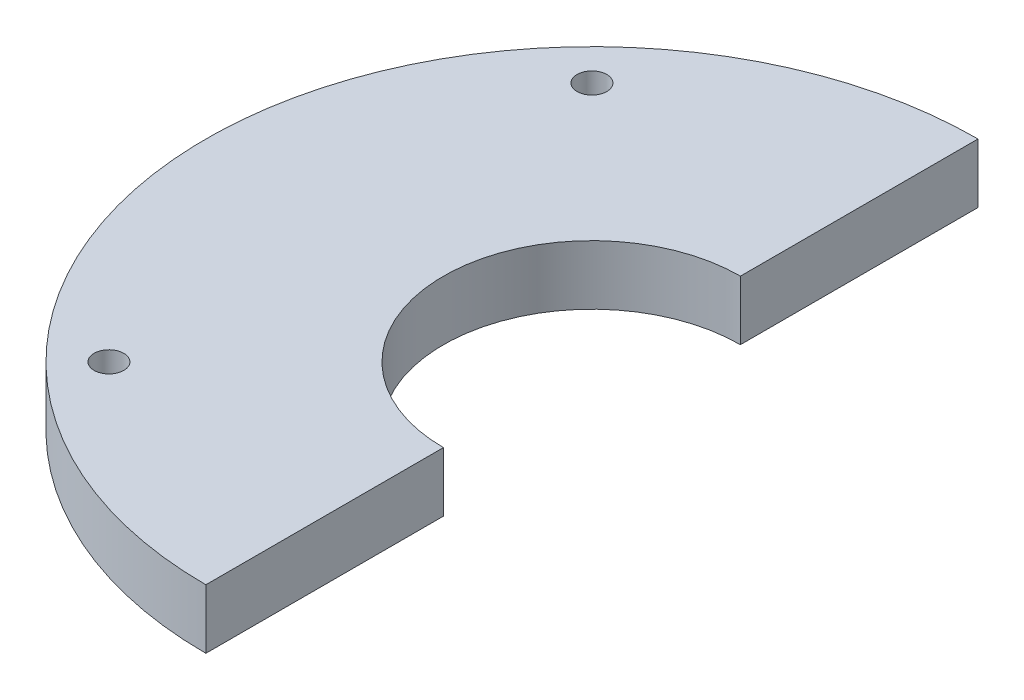
ISO-10303-21;
HEADER;
FILE_DESCRIPTION(('STEP AP214'),'2;1');
FILE_NAME('part.step','',(''),(''),'','','');
FILE_SCHEMA(('AUTOMOTIVE_DESIGN { 1 0 10303 214 1 1 1 1 }'));
ENDSEC;
DATA;
#1=APPLICATION_CONTEXT('core data for automotive mechanical design processes');
#2=APPLICATION_PROTOCOL_DEFINITION('international standard','automotive_design',2000,#1);
#3=PRODUCT_CONTEXT('',#1,'mechanical');
#4=PRODUCT('Part','Part','',(#3));
#5=PRODUCT_RELATED_PRODUCT_CATEGORY('part','',(#4));
#6=PRODUCT_DEFINITION_FORMATION('','',#4);
#7=PRODUCT_DEFINITION_CONTEXT('part definition',#1,'design');
#8=PRODUCT_DEFINITION('design','',#6,#7);
#9=PRODUCT_DEFINITION_SHAPE('','',#8);
#10=(LENGTH_UNIT() NAMED_UNIT(*) SI_UNIT(.MILLI.,.METRE.));
#11=(NAMED_UNIT(*) PLANE_ANGLE_UNIT() SI_UNIT($,.RADIAN.));
#12=(NAMED_UNIT(*) SI_UNIT($,.STERADIAN.) SOLID_ANGLE_UNIT());
#13=UNCERTAINTY_MEASURE_WITH_UNIT(LENGTH_MEASURE(1.E-05),#10,'distance_accuracy_value','');
#14=(GEOMETRIC_REPRESENTATION_CONTEXT(3) GLOBAL_UNCERTAINTY_ASSIGNED_CONTEXT((#13)) GLOBAL_UNIT_ASSIGNED_CONTEXT((#10,
#11,#12)) REPRESENTATION_CONTEXT('',''));
#15=CARTESIAN_POINT('',(0.,0.,0.));
#16=DIRECTION('',(0.,0.,1.));
#17=DIRECTION('',(1.,0.,0.));
#18=AXIS2_PLACEMENT_3D('',#15,#16,#17);
#19=CARTESIAN_POINT('',(0.,10.,0.));
#20=DIRECTION('',(0.,-1.,0.));
#21=DIRECTION('',(0.,0.,-1.));
#22=AXIS2_PLACEMENT_3D('',#19,#20,#21);
#23=CYLINDRICAL_SURFACE('',#22,25.);
#24=CARTESIAN_POINT('',(0.,0.,0.));
#25=DIRECTION('',(0.,-1.,0.));
#26=DIRECTION('',(0.,0.,1.));
#27=AXIS2_PLACEMENT_3D('',#24,#25,#26);
#28=CIRCLE('',#27,25.);
#29=CARTESIAN_POINT('',(0.,0.,25.));
#30=VERTEX_POINT('',#29);
#31=CARTESIAN_POINT('',(0.,0.,-25.));
#32=VERTEX_POINT('',#31);
#33=EDGE_CURVE('E110',#30,#32,#28,.T.);
#34=ORIENTED_EDGE('',*,*,#33,.T.);
#35=DIRECTION('',(0.,-1.,0.));
#36=VECTOR('',#35,1.);
#37=CARTESIAN_POINT('',(0.,10.,-25.));
#38=LINE('',#37,#36);
#39=CARTESIAN_POINT('',(0.,10.,-25.));
#40=VERTEX_POINT('',#39);
#41=EDGE_CURVE('E11',#40,#32,#38,.T.);
#42=ORIENTED_EDGE('',*,*,#41,.F.);
#43=CARTESIAN_POINT('',(0.,10.,0.));
#44=DIRECTION('',(0.,-1.,0.));
#45=DIRECTION('',(0.,0.,1.));
#46=AXIS2_PLACEMENT_3D('',#43,#44,#45);
#47=CIRCLE('',#46,25.);
#48=CARTESIAN_POINT('',(0.,10.,25.));
#49=VERTEX_POINT('',#48);
#50=EDGE_CURVE('E94',#49,#40,#47,.T.);
#51=ORIENTED_EDGE('',*,*,#50,.F.);
#52=DIRECTION('',(0.,-1.,0.));
#53=VECTOR('',#52,1.);
#54=CARTESIAN_POINT('',(0.,10.,25.));
#55=LINE('',#54,#53);
#56=EDGE_CURVE('E106',#49,#30,#55,.T.);
#57=ORIENTED_EDGE('',*,*,#56,.T.);
#58=EDGE_LOOP('',(#34,#42,#51,#57));
#59=FACE_BOUND('',#58,.T.);
#60=ADVANCED_FACE('F42',(#59),#23,.F.);
#61=CARTESIAN_POINT('',(0.,10.,-64.9999999999999));
#62=DIRECTION('',(-1.,0.,0.));
#63=DIRECTION('',(0.,0.,1.));
#64=AXIS2_PLACEMENT_3D('',#61,#62,#63);
#65=PLANE('',#64);
#66=DIRECTION('',(0.,0.,-1.));
#67=VECTOR('',#66,1.);
#68=CARTESIAN_POINT('',(0.,0.,-64.9999999999999));
#69=LINE('',#68,#67);
#70=CARTESIAN_POINT('',(0.,0.,-64.9999999999999));
#71=VERTEX_POINT('',#70);
#72=EDGE_CURVE('E99',#32,#71,#69,.T.);
#73=ORIENTED_EDGE('',*,*,#72,.T.);
#74=DIRECTION('',(0.,-1.,0.));
#75=VECTOR('',#74,1.);
#76=CARTESIAN_POINT('',(0.,10.,-64.9999999999999));
#77=LINE('',#76,#75);
#78=CARTESIAN_POINT('',(0.,10.,-64.9999999999999));
#79=VERTEX_POINT('',#78);
#80=EDGE_CURVE('E51',#79,#71,#77,.T.);
#81=ORIENTED_EDGE('',*,*,#80,.F.);
#82=DIRECTION('',(0.,0.,-1.));
#83=VECTOR('',#82,1.);
#84=CARTESIAN_POINT('',(0.,10.,-64.9999999999999));
#85=LINE('',#84,#83);
#86=EDGE_CURVE('E89',#40,#79,#85,.T.);
#87=ORIENTED_EDGE('',*,*,#86,.F.);
#88=ORIENTED_EDGE('',*,*,#41,.T.);
#89=EDGE_LOOP('',(#73,#81,#87,#88));
#90=FACE_BOUND('',#89,.T.);
#91=ADVANCED_FACE('F98',(#90),#65,.F.);
#92=CARTESIAN_POINT('',(0.,10.,0.));
#93=DIRECTION('',(0.,-1.,0.));
#94=DIRECTION('',(0.,0.,-1.));
#95=AXIS2_PLACEMENT_3D('',#92,#93,#94);
#96=CYLINDRICAL_SURFACE('',#95,64.9999999999999);
#97=CARTESIAN_POINT('',(0.,0.,0.));
#98=DIRECTION('',(0.,1.,0.));
#99=DIRECTION('',(0.,0.,1.));
#100=AXIS2_PLACEMENT_3D('',#97,#98,#99);
#101=CIRCLE('',#100,64.9999999999999);
#102=CARTESIAN_POINT('',(0.,0.,64.9999999999999));
#103=VERTEX_POINT('',#102);
#104=EDGE_CURVE('E76',#71,#103,#101,.T.);
#105=ORIENTED_EDGE('',*,*,#104,.T.);
#106=DIRECTION('',(0.,-1.,0.));
#107=VECTOR('',#106,1.);
#108=CARTESIAN_POINT('',(0.,10.,64.9999999999999));
#109=LINE('',#108,#107);
#110=CARTESIAN_POINT('',(0.,10.,64.9999999999999));
#111=VERTEX_POINT('',#110);
#112=EDGE_CURVE('E101',#111,#103,#109,.T.);
#113=ORIENTED_EDGE('',*,*,#112,.F.);
#114=CARTESIAN_POINT('',(0.,10.,0.));
#115=DIRECTION('',(0.,1.,0.));
#116=DIRECTION('',(0.,0.,1.));
#117=AXIS2_PLACEMENT_3D('',#114,#115,#116);
#118=CIRCLE('',#117,64.9999999999999);
#119=EDGE_CURVE('E92',#79,#111,#118,.T.);
#120=ORIENTED_EDGE('',*,*,#119,.F.);
#121=ORIENTED_EDGE('',*,*,#80,.T.);
#122=EDGE_LOOP('',(#105,#113,#120,#121));
#123=FACE_BOUND('',#122,.T.);
#124=ADVANCED_FACE('F102',(#123),#96,.T.);
#125=CARTESIAN_POINT('',(0.,10.,25.));
#126=DIRECTION('',(-1.,0.,0.));
#127=DIRECTION('',(0.,0.,1.));
#128=AXIS2_PLACEMENT_3D('',#125,#126,#127);
#129=PLANE('',#128);
#130=DIRECTION('',(0.,0.,-1.));
#131=VECTOR('',#130,1.);
#132=CARTESIAN_POINT('',(0.,0.,25.));
#133=LINE('',#132,#131);
#134=EDGE_CURVE('E82',#103,#30,#133,.T.);
#135=ORIENTED_EDGE('',*,*,#134,.T.);
#136=ORIENTED_EDGE('',*,*,#56,.F.);
#137=DIRECTION('',(0.,0.,-1.));
#138=VECTOR('',#137,1.);
#139=CARTESIAN_POINT('',(0.,10.,25.));
#140=LINE('',#139,#138);
#141=EDGE_CURVE('E59',#111,#49,#140,.T.);
#142=ORIENTED_EDGE('',*,*,#141,.F.);
#143=ORIENTED_EDGE('',*,*,#112,.T.);
#144=EDGE_LOOP('',(#135,#136,#142,#143));
#145=FACE_BOUND('',#144,.T.);
#146=ADVANCED_FACE('F124',(#145),#129,.F.);
#147=CARTESIAN_POINT('',(0.,10.,0.));
#148=DIRECTION('',(0.,1.,0.));
#149=DIRECTION('',(0.,0.,1.));
#150=AXIS2_PLACEMENT_3D('',#147,#148,#149);
#151=PLANE('',#150);
#152=CARTESIAN_POINT('',(-40.6586399182266,10.,-40.6586399182264));
#153=DIRECTION('',(0.,1.,0.));
#154=DIRECTION('',(0.,0.,1.));
#155=AXIS2_PLACEMENT_3D('',#152,#153,#154);
#156=CIRCLE('',#155,2.5);
#157=CARTESIAN_POINT('',(-40.6586399182266,10.,-38.1586399182264));
#158=VERTEX_POINT('',#157);
#159=EDGE_CURVE('E139',#158,#158,#156,.T.);
#160=ORIENTED_EDGE('',*,*,#159,.F.);
#161=EDGE_LOOP('',(#160));
#162=FACE_BOUND('',#161,.T.);
#163=CARTESIAN_POINT('',(-40.6586399182266,10.,40.6586399182264));
#164=DIRECTION('',(0.,1.,0.));
#165=DIRECTION('',(0.,0.,-1.));
#166=AXIS2_PLACEMENT_3D('',#163,#164,#165);
#167=CIRCLE('',#166,2.5);
#168=CARTESIAN_POINT('',(-40.6586399182266,10.,38.1586399182264));
#169=VERTEX_POINT('',#168);
#170=EDGE_CURVE('E135',#169,#169,#167,.T.);
#171=ORIENTED_EDGE('',*,*,#170,.F.);
#172=EDGE_LOOP('',(#171));
#173=FACE_BOUND('',#172,.T.);
#174=ORIENTED_EDGE('',*,*,#50,.T.);
#175=ORIENTED_EDGE('',*,*,#86,.T.);
#176=ORIENTED_EDGE('',*,*,#119,.T.);
#177=ORIENTED_EDGE('',*,*,#141,.T.);
#178=EDGE_LOOP('',(#174,#175,#176,#177));
#179=FACE_BOUND('',#178,.T.);
#180=ADVANCED_FACE('F90',(#162,#173,#179),#151,.T.);
#181=CARTESIAN_POINT('',(0.,0.,0.));
#182=DIRECTION('',(0.,1.,0.));
#183=DIRECTION('',(0.,0.,1.));
#184=AXIS2_PLACEMENT_3D('',#181,#182,#183);
#185=PLANE('',#184);
#186=CARTESIAN_POINT('',(-40.6586399182266,0.,-40.6586399182264));
#187=DIRECTION('',(0.,1.,0.));
#188=DIRECTION('',(0.,0.,1.));
#189=AXIS2_PLACEMENT_3D('',#186,#187,#188);
#190=CIRCLE('',#189,2.5);
#191=CARTESIAN_POINT('',(-40.6586399182266,0.,-38.1586399182264));
#192=VERTEX_POINT('',#191);
#193=EDGE_CURVE('E114',#192,#192,#190,.T.);
#194=ORIENTED_EDGE('',*,*,#193,.T.);
#195=EDGE_LOOP('',(#194));
#196=FACE_BOUND('',#195,.T.);
#197=CARTESIAN_POINT('',(-40.6586399182266,0.,40.6586399182264));
#198=DIRECTION('',(0.,1.,0.));
#199=DIRECTION('',(0.,0.,-1.));
#200=AXIS2_PLACEMENT_3D('',#197,#198,#199);
#201=CIRCLE('',#200,2.5);
#202=CARTESIAN_POINT('',(-40.6586399182266,0.,38.1586399182264));
#203=VERTEX_POINT('',#202);
#204=EDGE_CURVE('E131',#203,#203,#201,.T.);
#205=ORIENTED_EDGE('',*,*,#204,.T.);
#206=EDGE_LOOP('',(#205));
#207=FACE_BOUND('',#206,.T.);
#208=ORIENTED_EDGE('',*,*,#33,.F.);
#209=ORIENTED_EDGE('',*,*,#134,.F.);
#210=ORIENTED_EDGE('',*,*,#104,.F.);
#211=ORIENTED_EDGE('',*,*,#72,.F.);
#212=EDGE_LOOP('',(#208,#209,#210,#211));
#213=FACE_BOUND('',#212,.T.);
#214=ADVANCED_FACE('F127',(#196,#207,#213),#185,.F.);
#215=CARTESIAN_POINT('',(-40.6586399182266,0.,40.6586399182264));
#216=DIRECTION('',(0.,1.,0.));
#217=DIRECTION('',(0.,0.,1.));
#218=AXIS2_PLACEMENT_3D('',#215,#216,#217);
#219=CYLINDRICAL_SURFACE('',#218,2.5);
#220=ORIENTED_EDGE('',*,*,#204,.F.);
#221=EDGE_LOOP('',(#220));
#222=FACE_BOUND('',#221,.T.);
#223=ORIENTED_EDGE('',*,*,#170,.T.);
#224=EDGE_LOOP('',(#223));
#225=FACE_BOUND('',#224,.T.);
#226=ADVANCED_FACE('F152',(#222,#225),#219,.F.);
#227=CARTESIAN_POINT('',(-40.6586399182266,0.,-40.6586399182264));
#228=DIRECTION('',(0.,1.,0.));
#229=DIRECTION('',(0.,0.,1.));
#230=AXIS2_PLACEMENT_3D('',#227,#228,#229);
#231=CYLINDRICAL_SURFACE('',#230,2.5);
#232=ORIENTED_EDGE('',*,*,#193,.F.);
#233=EDGE_LOOP('',(#232));
#234=FACE_BOUND('',#233,.T.);
#235=ORIENTED_EDGE('',*,*,#159,.T.);
#236=EDGE_LOOP('',(#235));
#237=FACE_BOUND('',#236,.T.);
#238=ADVANCED_FACE('F149',(#234,#237),#231,.F.);
#239=CLOSED_SHELL('',(#60,#91,#124,#146,#180,#214,#226,#238));
#240=MANIFOLD_SOLID_BREP('B2',#239);
#241=ADVANCED_BREP_SHAPE_REPRESENTATION('',(#18,#240),#14);
#242=SHAPE_DEFINITION_REPRESENTATION(#9,#241);
ENDSEC;
END-ISO-10303-21;
